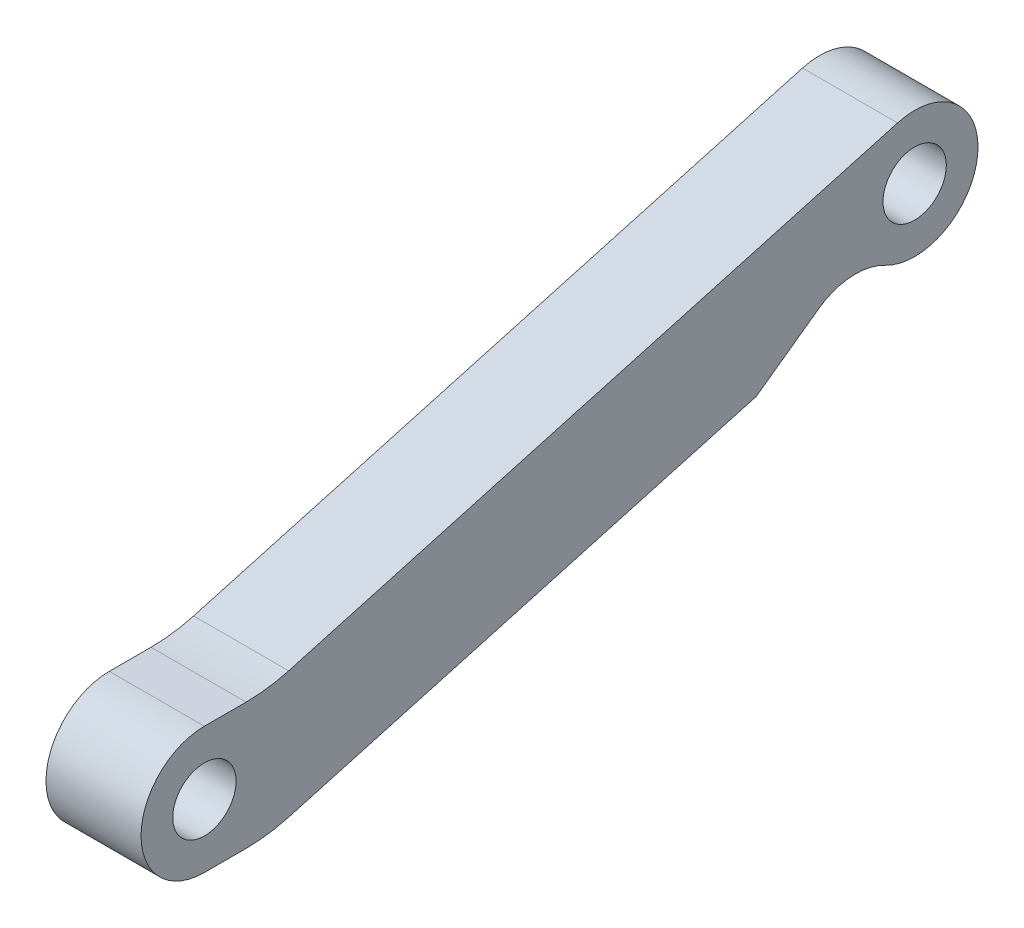
ISO-10303-21;
HEADER;
FILE_DESCRIPTION(('STEP AP214'),'2;1');
FILE_NAME('part.step','',(''),(''),'','','');
FILE_SCHEMA(('AUTOMOTIVE_DESIGN { 1 0 10303 214 1 1 1 1 }'));
ENDSEC;
DATA;
#1=APPLICATION_CONTEXT('core data for automotive mechanical design processes');
#2=APPLICATION_PROTOCOL_DEFINITION('international standard','automotive_design',2000,#1);
#3=PRODUCT_CONTEXT('',#1,'mechanical');
#4=PRODUCT('Part','Part','',(#3));
#5=PRODUCT_RELATED_PRODUCT_CATEGORY('part','',(#4));
#6=PRODUCT_DEFINITION_FORMATION('','',#4);
#7=PRODUCT_DEFINITION_CONTEXT('part definition',#1,'design');
#8=PRODUCT_DEFINITION('design','',#6,#7);
#9=PRODUCT_DEFINITION_SHAPE('','',#8);
#10=(LENGTH_UNIT() NAMED_UNIT(*) SI_UNIT(.MILLI.,.METRE.));
#11=(NAMED_UNIT(*) PLANE_ANGLE_UNIT() SI_UNIT($,.RADIAN.));
#12=(NAMED_UNIT(*) SI_UNIT($,.STERADIAN.) SOLID_ANGLE_UNIT());
#13=UNCERTAINTY_MEASURE_WITH_UNIT(LENGTH_MEASURE(1.E-05),#10,'distance_accuracy_value','');
#14=(GEOMETRIC_REPRESENTATION_CONTEXT(3) GLOBAL_UNCERTAINTY_ASSIGNED_CONTEXT((#13)) GLOBAL_UNIT_ASSIGNED_CONTEXT((#10,
#11,#12)) REPRESENTATION_CONTEXT('',''));
#15=CARTESIAN_POINT('',(0.,0.,0.));
#16=DIRECTION('',(0.,0.,1.));
#17=DIRECTION('',(1.,0.,0.));
#18=AXIS2_PLACEMENT_3D('',#15,#16,#17);
#19=CARTESIAN_POINT('',(-1.5,-1.91202925532679,-63.1081173356861));
#20=DIRECTION('',(1.,0.,0.));
#21=DIRECTION('',(0.,0.,-1.));
#22=AXIS2_PLACEMENT_3D('',#19,#20,#21);
#23=CYLINDRICAL_SURFACE('',#22,2.);
#24=DIRECTION('',(1.,0.,0.));
#25=VECTOR('',#24,1.);
#26=CARTESIAN_POINT('',(-1.5,-0.143514627663402,-64.0421173419712));
#27=LINE('',#26,#25);
#28=CARTESIAN_POINT('',(-1.5,-0.143514627663402,-64.0421173419712));
#29=VERTEX_POINT('',#28);
#30=CARTESIAN_POINT('',(1.5,-0.143514627663402,-64.0421173419712));
#31=VERTEX_POINT('',#30);
#32=EDGE_CURVE('E43',#29,#31,#27,.T.);
#33=ORIENTED_EDGE('',*,*,#32,.T.);
#34=CARTESIAN_POINT('',(1.5,-1.91202925532679,-63.1081173356861));
#35=DIRECTION('',(1.,0.,0.));
#36=DIRECTION('',(0.,0.,-1.));
#37=AXIS2_PLACEMENT_3D('',#34,#35,#36);
#38=CIRCLE('',#37,2.);
#39=CARTESIAN_POINT('',(1.5,-0.285871443395359,-61.9438103440836));
#40=VERTEX_POINT('',#39);
#41=EDGE_CURVE('E120',#31,#40,#38,.T.);
#42=ORIENTED_EDGE('',*,*,#41,.T.);
#43=DIRECTION('',(1.,0.,0.));
#44=VECTOR('',#43,1.);
#45=CARTESIAN_POINT('',(-1.5,-0.285871443395359,-61.9438103440836));
#46=LINE('',#45,#44);
#47=CARTESIAN_POINT('',(-1.5,-0.285871443395359,-61.9438103440836));
#48=VERTEX_POINT('',#47);
#49=EDGE_CURVE('E11',#48,#40,#46,.T.);
#50=ORIENTED_EDGE('',*,*,#49,.F.);
#51=CARTESIAN_POINT('',(-1.5,-1.91202925532679,-63.1081173356861));
#52=DIRECTION('',(1.,0.,0.));
#53=DIRECTION('',(0.,0.,-1.));
#54=AXIS2_PLACEMENT_3D('',#51,#52,#53);
#55=CIRCLE('',#54,2.);
#56=EDGE_CURVE('E56',#29,#48,#55,.T.);
#57=ORIENTED_EDGE('',*,*,#56,.F.);
#58=EDGE_LOOP('',(#33,#42,#50,#57));
#59=FACE_BOUND('',#58,.T.);
#60=ADVANCED_FACE('F39',(#59),#23,.F.);
#61=CARTESIAN_POINT('',(-1.5,-29.5092693167723,-21.1282375735662));
#62=DIRECTION('',(0.,-0.813078905965717,-0.58215349580123));
#63=DIRECTION('',(0.,0.58215349580123,-0.813078905965717));
#64=AXIS2_PLACEMENT_3D('',#61,#62,#63);
#65=PLANE('',#64);
#66=ORIENTED_EDGE('',*,*,#49,.T.);
#67=DIRECTION('',(0.,0.58215349580123,-0.813078905965717));
#68=VECTOR('',#67,1.);
#69=CARTESIAN_POINT('',(1.5,-29.5092693167723,-21.1282375735662));
#70=LINE('',#69,#68);
#71=CARTESIAN_POINT('',(1.5,-1.69471300573291,-59.9761173482563));
#72=VERTEX_POINT('',#71);
#73=EDGE_CURVE('E137',#72,#40,#70,.T.);
#74=ORIENTED_EDGE('',*,*,#73,.F.);
#75=DIRECTION('',(1.,0.,0.));
#76=VECTOR('',#75,1.);
#77=CARTESIAN_POINT('',(-1.5,-1.69471300573291,-59.9761173482563));
#78=LINE('',#77,#76);
#79=CARTESIAN_POINT('',(-1.5,-1.69471300573291,-59.9761173482563));
#80=VERTEX_POINT('',#79);
#81=EDGE_CURVE('E48',#80,#72,#78,.T.);
#82=ORIENTED_EDGE('',*,*,#81,.F.);
#83=DIRECTION('',(0.,0.58215349580123,-0.813078905965717));
#84=VECTOR('',#83,1.);
#85=CARTESIAN_POINT('',(-1.5,-29.5092693167723,-21.1282375735662));
#86=LINE('',#85,#84);
#87=EDGE_CURVE('E124',#80,#48,#86,.T.);
#88=ORIENTED_EDGE('',*,*,#87,.T.);
#89=EDGE_LOOP('',(#66,#74,#82,#88));
#90=FACE_BOUND('',#89,.T.);
#91=ADVANCED_FACE('F232',(#90),#65,.T.);
#92=CARTESIAN_POINT('',(-1.5,-17.108672315639,-4.77751952631985));
#93=DIRECTION('',(0.,-0.96315247012414,-0.268955980215663));
#94=DIRECTION('',(0.,0.268955980215663,-0.96315247012414));
#95=AXIS2_PLACEMENT_3D('',#92,#93,#94);
#96=PLANE('',#95);
#97=ORIENTED_EDGE('',*,*,#81,.T.);
#98=DIRECTION('',(0.,0.268955980215663,-0.96315247012414));
#99=VECTOR('',#98,1.);
#100=CARTESIAN_POINT('',(1.5,-17.108672315639,-4.77751952631985));
#101=LINE('',#100,#99);
#102=CARTESIAN_POINT('',(1.5,-5.8157623506207,-45.2183162655311));
#103=VERTEX_POINT('',#102);
#104=EDGE_CURVE('E161',#103,#72,#101,.T.);
#105=ORIENTED_EDGE('',*,*,#104,.F.);
#106=DIRECTION('',(1.,0.,0.));
#107=VECTOR('',#106,1.);
#108=CARTESIAN_POINT('',(-1.5,-5.8157623506207,-45.2183162655311));
#109=LINE('',#108,#107);
#110=CARTESIAN_POINT('',(-1.5,-5.8157623506207,-45.2183162655311));
#111=VERTEX_POINT('',#110);
#112=EDGE_CURVE('E192',#111,#103,#109,.T.);
#113=ORIENTED_EDGE('',*,*,#112,.F.);
#114=DIRECTION('',(0.,0.268955980215663,-0.96315247012414));
#115=VECTOR('',#114,1.);
#116=CARTESIAN_POINT('',(-1.5,-17.108672315639,-4.77751952631985));
#117=LINE('',#116,#115);
#118=EDGE_CURVE('E188',#111,#80,#117,.T.);
#119=ORIENTED_EDGE('',*,*,#118,.T.);
#120=EDGE_LOOP('',(#97,#105,#113,#119));
#121=FACE_BOUND('',#120,.T.);
#122=ADVANCED_FACE('F230',(#121),#96,.T.);
#123=CARTESIAN_POINT('',(-1.5,-1.00000000000001,-43.8735363644528));
#124=DIRECTION('',(1.,0.,0.));
#125=DIRECTION('',(0.,0.,-1.));
#126=AXIS2_PLACEMENT_3D('',#123,#124,#125);
#127=CYLINDRICAL_SURFACE('',#126,5.);
#128=ORIENTED_EDGE('',*,*,#112,.T.);
#129=CARTESIAN_POINT('',(1.5,-1.00000000000001,-43.8735363644528));
#130=DIRECTION('',(1.,0.,0.));
#131=DIRECTION('',(0.,0.,-1.));
#132=AXIS2_PLACEMENT_3D('',#129,#130,#131);
#133=CIRCLE('',#132,5.);
#134=CARTESIAN_POINT('',(1.5,-6.00000000000001,-43.8735363644528));
#135=VERTEX_POINT('',#134);
#136=EDGE_CURVE('E158',#135,#103,#133,.T.);
#137=ORIENTED_EDGE('',*,*,#136,.F.);
#138=DIRECTION('',(1.,0.,0.));
#139=VECTOR('',#138,1.);
#140=CARTESIAN_POINT('',(-1.5,-6.00000000000001,-43.8735363644528));
#141=LINE('',#140,#139);
#142=CARTESIAN_POINT('',(-1.5,-6.00000000000001,-43.8735363644528));
#143=VERTEX_POINT('',#142);
#144=EDGE_CURVE('E194',#143,#135,#141,.T.);
#145=ORIENTED_EDGE('',*,*,#144,.F.);
#146=CARTESIAN_POINT('',(-1.5,-1.00000000000001,-43.8735363644528));
#147=DIRECTION('',(1.,0.,0.));
#148=DIRECTION('',(0.,0.,-1.));
#149=AXIS2_PLACEMENT_3D('',#146,#147,#148);
#150=CIRCLE('',#149,5.);
#151=EDGE_CURVE('E185',#143,#111,#150,.T.);
#152=ORIENTED_EDGE('',*,*,#151,.T.);
#153=EDGE_LOOP('',(#128,#137,#145,#152));
#154=FACE_BOUND('',#153,.T.);
#155=ADVANCED_FACE('F227',(#154),#127,.T.);
#156=CARTESIAN_POINT('',(-1.5,-6.00000000000004,0.));
#157=DIRECTION('',(0.,-1.,0.));
#158=DIRECTION('',(0.,0.,-1.));
#159=AXIS2_PLACEMENT_3D('',#156,#157,#158);
#160=PLANE('',#159);
#161=ORIENTED_EDGE('',*,*,#144,.T.);
#162=DIRECTION('',(0.,0.,-1.));
#163=VECTOR('',#162,1.);
#164=CARTESIAN_POINT('',(1.5,-6.00000000000004,0.));
#165=LINE('',#164,#163);
#166=CARTESIAN_POINT('',(1.5,-6.00000000000001,-42.5585467859781));
#167=VERTEX_POINT('',#166);
#168=EDGE_CURVE('E155',#167,#135,#165,.T.);
#169=ORIENTED_EDGE('',*,*,#168,.F.);
#170=DIRECTION('',(1.,0.,0.));
#171=VECTOR('',#170,1.);
#172=CARTESIAN_POINT('',(-1.5,-6.00000000000001,-42.5585467859781));
#173=LINE('',#172,#171);
#174=CARTESIAN_POINT('',(-1.5,-6.00000000000001,-42.5585467859781));
#175=VERTEX_POINT('',#174);
#176=EDGE_CURVE('E196',#175,#167,#173,.T.);
#177=ORIENTED_EDGE('',*,*,#176,.F.);
#178=DIRECTION('',(0.,0.,-1.));
#179=VECTOR('',#178,1.);
#180=CARTESIAN_POINT('',(-1.5,-6.00000000000004,0.));
#181=LINE('',#180,#179);
#182=EDGE_CURVE('E182',#175,#143,#181,.T.);
#183=ORIENTED_EDGE('',*,*,#182,.T.);
#184=EDGE_LOOP('',(#161,#169,#177,#183));
#185=FACE_BOUND('',#184,.T.);
#186=ADVANCED_FACE('F223',(#185),#160,.T.);
#187=CARTESIAN_POINT('',(-1.5,-4.00000000000001,-42.5585467859781));
#188=DIRECTION('',(1.,0.,0.));
#189=DIRECTION('',(0.,0.,-1.));
#190=AXIS2_PLACEMENT_3D('',#187,#188,#189);
#191=CYLINDRICAL_SURFACE('',#190,2.);
#192=ORIENTED_EDGE('',*,*,#176,.T.);
#193=CARTESIAN_POINT('',(1.5,-4.00000000000001,-42.5585467859781));
#194=DIRECTION('',(1.,0.,0.));
#195=DIRECTION('',(0.,0.,-1.));
#196=AXIS2_PLACEMENT_3D('',#193,#194,#195);
#197=CIRCLE('',#196,2.);
#198=CARTESIAN_POINT('',(1.5,-2.00000000000001,-42.5585467859781));
#199=VERTEX_POINT('',#198);
#200=EDGE_CURVE('E152',#199,#167,#197,.T.);
#201=ORIENTED_EDGE('',*,*,#200,.F.);
#202=DIRECTION('',(1.,0.,0.));
#203=VECTOR('',#202,1.);
#204=CARTESIAN_POINT('',(-1.5,-2.00000000000001,-42.5585467859781));
#205=LINE('',#204,#203);
#206=CARTESIAN_POINT('',(-1.5,-2.00000000000001,-42.5585467859781));
#207=VERTEX_POINT('',#206);
#208=EDGE_CURVE('E198',#207,#199,#205,.T.);
#209=ORIENTED_EDGE('',*,*,#208,.F.);
#210=CARTESIAN_POINT('',(-1.5,-4.00000000000001,-42.5585467859781));
#211=DIRECTION('',(1.,0.,0.));
#212=DIRECTION('',(0.,0.,-1.));
#213=AXIS2_PLACEMENT_3D('',#210,#211,#212);
#214=CIRCLE('',#213,2.);
#215=EDGE_CURVE('E179',#207,#175,#214,.T.);
#216=ORIENTED_EDGE('',*,*,#215,.T.);
#217=EDGE_LOOP('',(#192,#201,#209,#216));
#218=FACE_BOUND('',#217,.T.);
#219=ADVANCED_FACE('F220',(#218),#191,.T.);
#220=CARTESIAN_POINT('',(-1.5,-2.00000000000001,0.));
#221=DIRECTION('',(0.,-1.,0.));
#222=DIRECTION('',(0.,0.,-1.));
#223=AXIS2_PLACEMENT_3D('',#220,#221,#222);
#224=PLANE('',#223);
#225=ORIENTED_EDGE('',*,*,#208,.T.);
#226=DIRECTION('',(0.,0.,-1.));
#227=VECTOR('',#226,1.);
#228=CARTESIAN_POINT('',(1.5,-2.00000000000001,0.));
#229=LINE('',#228,#227);
#230=CARTESIAN_POINT('',(1.5,-2.00000000000001,-43.8735363644527));
#231=VERTEX_POINT('',#230);
#232=EDGE_CURVE('E149',#199,#231,#229,.T.);
#233=ORIENTED_EDGE('',*,*,#232,.T.);
#234=DIRECTION('',(1.,0.,0.));
#235=VECTOR('',#234,1.);
#236=CARTESIAN_POINT('',(-1.5,-2.00000000000001,-43.8735363644527));
#237=LINE('',#236,#235);
#238=CARTESIAN_POINT('',(-1.5,-2.00000000000001,-43.8735363644527));
#239=VERTEX_POINT('',#238);
#240=EDGE_CURVE('E200',#239,#231,#237,.T.);
#241=ORIENTED_EDGE('',*,*,#240,.F.);
#242=DIRECTION('',(0.,0.,-1.));
#243=VECTOR('',#242,1.);
#244=CARTESIAN_POINT('',(-1.5,-2.00000000000001,0.));
#245=LINE('',#244,#243);
#246=EDGE_CURVE('E177',#207,#239,#245,.T.);
#247=ORIENTED_EDGE('',*,*,#246,.F.);
#248=EDGE_LOOP('',(#225,#233,#241,#247));
#249=FACE_BOUND('',#248,.T.);
#250=ADVANCED_FACE('F215',(#249),#224,.F.);
#251=CARTESIAN_POINT('',(-1.5,2.99999999999999,-43.8735363644527));
#252=DIRECTION('',(1.,0.,0.));
#253=DIRECTION('',(0.,0.,-1.));
#254=AXIS2_PLACEMENT_3D('',#251,#252,#253);
#255=CYLINDRICAL_SURFACE('',#254,5.);
#256=ORIENTED_EDGE('',*,*,#240,.T.);
#257=CARTESIAN_POINT('',(1.5,2.99999999999999,-43.8735363644527));
#258=DIRECTION('',(1.,0.,0.));
#259=DIRECTION('',(0.,0.,-1.));
#260=AXIS2_PLACEMENT_3D('',#257,#258,#259);
#261=CIRCLE('',#260,5.);
#262=CARTESIAN_POINT('',(1.5,-1.8157623506207,-45.2183162655311));
#263=VERTEX_POINT('',#262);
#264=EDGE_CURVE('E146',#231,#263,#261,.T.);
#265=ORIENTED_EDGE('',*,*,#264,.T.);
#266=DIRECTION('',(1.,0.,0.));
#267=VECTOR('',#266,1.);
#268=CARTESIAN_POINT('',(-1.5,-1.8157623506207,-45.2183162655311));
#269=LINE('',#268,#267);
#270=CARTESIAN_POINT('',(-1.5,-1.8157623506207,-45.2183162655311));
#271=VERTEX_POINT('',#270);
#272=EDGE_CURVE('E202',#271,#263,#269,.T.);
#273=ORIENTED_EDGE('',*,*,#272,.F.);
#274=CARTESIAN_POINT('',(-1.5,2.99999999999999,-43.8735363644527));
#275=DIRECTION('',(1.,0.,0.));
#276=DIRECTION('',(0.,0.,-1.));
#277=AXIS2_PLACEMENT_3D('',#274,#275,#276);
#278=CIRCLE('',#277,5.);
#279=EDGE_CURVE('E175',#239,#271,#278,.T.);
#280=ORIENTED_EDGE('',*,*,#279,.F.);
#281=EDGE_LOOP('',(#256,#265,#273,#280));
#282=FACE_BOUND('',#281,.T.);
#283=ADVANCED_FACE('F211',(#282),#255,.F.);
#284=CARTESIAN_POINT('',(-1.5,-13.3980215928141,-3.74133705952235));
#285=DIRECTION('',(0.,-0.96315247012414,-0.268955980215663));
#286=DIRECTION('',(0.,0.268955980215663,-0.96315247012414));
#287=AXIS2_PLACEMENT_3D('',#284,#285,#286);
#288=PLANE('',#287);
#289=ORIENTED_EDGE('',*,*,#272,.T.);
#290=DIRECTION('',(0.,0.268955980215663,-0.96315247012414));
#291=VECTOR('',#290,1.);
#292=CARTESIAN_POINT('',(1.5,-13.3980215928141,-3.74133705952235));
#293=LINE('',#292,#291);
#294=CARTESIAN_POINT('',(1.5,3.55130494024827,-64.438205387825));
#295=VERTEX_POINT('',#294);
#296=EDGE_CURVE('E132',#263,#295,#293,.T.);
#297=ORIENTED_EDGE('',*,*,#296,.T.);
#298=DIRECTION('',(1.,0.,0.));
#299=VECTOR('',#298,1.);
#300=CARTESIAN_POINT('',(-1.5,3.55130494024827,-64.438205387825));
#301=LINE('',#300,#299);
#302=CARTESIAN_POINT('',(-1.5,3.55130494024827,-64.438205387825));
#303=VERTEX_POINT('',#302);
#304=EDGE_CURVE('E123',#303,#295,#301,.T.);
#305=ORIENTED_EDGE('',*,*,#304,.F.);
#306=DIRECTION('',(0.,0.268955980215663,-0.96315247012414));
#307=VECTOR('',#306,1.);
#308=CARTESIAN_POINT('',(-1.5,-13.3980215928141,-3.74133705952235));
#309=LINE('',#308,#307);
#310=EDGE_CURVE('E173',#271,#303,#309,.T.);
#311=ORIENTED_EDGE('',*,*,#310,.F.);
#312=EDGE_LOOP('',(#289,#297,#305,#311));
#313=FACE_BOUND('',#312,.T.);
#314=ADVANCED_FACE('F206',(#313),#288,.F.);
#315=CARTESIAN_POINT('',(-1.5,1.62499999999999,-64.9761173482563));
#316=DIRECTION('',(1.,0.,0.));
#317=DIRECTION('',(0.,0.,-1.));
#318=AXIS2_PLACEMENT_3D('',#315,#316,#317);
#319=CYLINDRICAL_SURFACE('',#318,1.00000000000001);
#320=CARTESIAN_POINT('',(-1.5,1.62499999999999,-64.9761173482563));
#321=DIRECTION('',(1.,0.,0.));
#322=DIRECTION('',(0.,0.,-1.));
#323=AXIS2_PLACEMENT_3D('',#320,#321,#322);
#324=CIRCLE('',#323,1.00000000000001);
#325=CARTESIAN_POINT('',(-1.5,1.62499999999999,-65.9761173482564));
#326=VERTEX_POINT('',#325);
#327=EDGE_CURVE('E167',#326,#326,#324,.T.);
#328=ORIENTED_EDGE('',*,*,#327,.F.);
#329=EDGE_LOOP('',(#328));
#330=FACE_BOUND('',#329,.T.);
#331=CARTESIAN_POINT('',(1.5,1.62499999999999,-64.9761173482563));
#332=DIRECTION('',(1.,0.,0.));
#333=DIRECTION('',(0.,0.,-1.));
#334=AXIS2_PLACEMENT_3D('',#331,#332,#333);
#335=CIRCLE('',#334,1.00000000000001);
#336=CARTESIAN_POINT('',(1.5,1.62499999999999,-65.9761173482564));
#337=VERTEX_POINT('',#336);
#338=EDGE_CURVE('E138',#337,#337,#335,.T.);
#339=ORIENTED_EDGE('',*,*,#338,.T.);
#340=EDGE_LOOP('',(#339));
#341=FACE_BOUND('',#340,.T.);
#342=ADVANCED_FACE('F252',(#330,#341),#319,.F.);
#343=CARTESIAN_POINT('',(-1.5,-4.00000000000001,-42.5585467859781));
#344=DIRECTION('',(1.,0.,0.));
#345=DIRECTION('',(0.,0.,-1.));
#346=AXIS2_PLACEMENT_3D('',#343,#344,#345);
#347=CYLINDRICAL_SURFACE('',#346,1.00000000000001);
#348=CARTESIAN_POINT('',(-1.5,-4.00000000000001,-42.5585467859781));
#349=DIRECTION('',(1.,0.,0.));
#350=DIRECTION('',(0.,0.,-1.));
#351=AXIS2_PLACEMENT_3D('',#348,#349,#350);
#352=CIRCLE('',#351,1.00000000000001);
#353=CARTESIAN_POINT('',(-1.5,-4.00000000000001,-43.5585467859781));
#354=VERTEX_POINT('',#353);
#355=EDGE_CURVE('E164',#354,#354,#352,.T.);
#356=ORIENTED_EDGE('',*,*,#355,.F.);
#357=EDGE_LOOP('',(#356));
#358=FACE_BOUND('',#357,.T.);
#359=CARTESIAN_POINT('',(1.5,-4.00000000000001,-42.5585467859781));
#360=DIRECTION('',(1.,0.,0.));
#361=DIRECTION('',(0.,0.,-1.));
#362=AXIS2_PLACEMENT_3D('',#359,#360,#361);
#363=CIRCLE('',#362,1.00000000000001);
#364=CARTESIAN_POINT('',(1.5,-4.00000000000001,-43.5585467859781));
#365=VERTEX_POINT('',#364);
#366=EDGE_CURVE('E141',#365,#365,#363,.T.);
#367=ORIENTED_EDGE('',*,*,#366,.T.);
#368=EDGE_LOOP('',(#367));
#369=FACE_BOUND('',#368,.T.);
#370=ADVANCED_FACE('F41',(#358,#369),#347,.F.);
#371=CARTESIAN_POINT('',(-1.5,1.62499999999999,-64.9761173482563));
#372=DIRECTION('',(1.,0.,0.));
#373=DIRECTION('',(0.,0.,-1.));
#374=AXIS2_PLACEMENT_3D('',#371,#372,#373);
#375=CYLINDRICAL_SURFACE('',#374,2.);
#376=ORIENTED_EDGE('',*,*,#304,.T.);
#377=CARTESIAN_POINT('',(1.5,1.62499999999999,-64.9761173482563));
#378=DIRECTION('',(1.,0.,0.));
#379=DIRECTION('',(0.,0.,-1.));
#380=AXIS2_PLACEMENT_3D('',#377,#378,#379);
#381=CIRCLE('',#380,2.);
#382=EDGE_CURVE('E126',#31,#295,#381,.T.);
#383=ORIENTED_EDGE('',*,*,#382,.F.);
#384=ORIENTED_EDGE('',*,*,#32,.F.);
#385=CARTESIAN_POINT('',(-1.5,1.62499999999999,-64.9761173482563));
#386=DIRECTION('',(1.,0.,0.));
#387=DIRECTION('',(0.,0.,-1.));
#388=AXIS2_PLACEMENT_3D('',#385,#386,#387);
#389=CIRCLE('',#388,2.);
#390=EDGE_CURVE('E171',#29,#303,#389,.T.);
#391=ORIENTED_EDGE('',*,*,#390,.T.);
#392=EDGE_LOOP('',(#376,#383,#384,#391));
#393=FACE_BOUND('',#392,.T.);
#394=ADVANCED_FACE('F127',(#393),#375,.T.);
#395=CARTESIAN_POINT('',(-1.5,0.,0.));
#396=DIRECTION('',(1.,0.,0.));
#397=DIRECTION('',(0.,0.,-1.));
#398=AXIS2_PLACEMENT_3D('',#395,#396,#397);
#399=PLANE('',#398);
#400=ORIENTED_EDGE('',*,*,#355,.T.);
#401=EDGE_LOOP('',(#400));
#402=FACE_BOUND('',#401,.T.);
#403=ORIENTED_EDGE('',*,*,#327,.T.);
#404=EDGE_LOOP('',(#403));
#405=FACE_BOUND('',#404,.T.);
#406=ORIENTED_EDGE('',*,*,#56,.T.);
#407=ORIENTED_EDGE('',*,*,#87,.F.);
#408=ORIENTED_EDGE('',*,*,#118,.F.);
#409=ORIENTED_EDGE('',*,*,#151,.F.);
#410=ORIENTED_EDGE('',*,*,#182,.F.);
#411=ORIENTED_EDGE('',*,*,#215,.F.);
#412=ORIENTED_EDGE('',*,*,#246,.T.);
#413=ORIENTED_EDGE('',*,*,#279,.T.);
#414=ORIENTED_EDGE('',*,*,#310,.T.);
#415=ORIENTED_EDGE('',*,*,#390,.F.);
#416=EDGE_LOOP('',(#406,#407,#408,#409,#410,#411,#412,#413,#414,#415));
#417=FACE_BOUND('',#416,.T.);
#418=ADVANCED_FACE('F233',(#402,#405,#417),#399,.F.);
#419=CARTESIAN_POINT('',(1.5,0.,0.));
#420=DIRECTION('',(1.,0.,0.));
#421=DIRECTION('',(0.,0.,-1.));
#422=AXIS2_PLACEMENT_3D('',#419,#420,#421);
#423=PLANE('',#422);
#424=ORIENTED_EDGE('',*,*,#366,.F.);
#425=EDGE_LOOP('',(#424));
#426=FACE_BOUND('',#425,.T.);
#427=ORIENTED_EDGE('',*,*,#338,.F.);
#428=EDGE_LOOP('',(#427));
#429=FACE_BOUND('',#428,.T.);
#430=ORIENTED_EDGE('',*,*,#41,.F.);
#431=ORIENTED_EDGE('',*,*,#382,.T.);
#432=ORIENTED_EDGE('',*,*,#296,.F.);
#433=ORIENTED_EDGE('',*,*,#264,.F.);
#434=ORIENTED_EDGE('',*,*,#232,.F.);
#435=ORIENTED_EDGE('',*,*,#200,.T.);
#436=ORIENTED_EDGE('',*,*,#168,.T.);
#437=ORIENTED_EDGE('',*,*,#136,.T.);
#438=ORIENTED_EDGE('',*,*,#104,.T.);
#439=ORIENTED_EDGE('',*,*,#73,.T.);
#440=EDGE_LOOP('',(#430,#431,#432,#433,#434,#435,#436,#437,#438,#439));
#441=FACE_BOUND('',#440,.T.);
#442=ADVANCED_FACE('F135',(#426,#429,#441),#423,.T.);
#443=CLOSED_SHELL('',(#60,#91,#122,#155,#186,#219,#250,#283,#314,#342,#370,#394,#418,#442));
#444=MANIFOLD_SOLID_BREP('B2',#443);
#445=ADVANCED_BREP_SHAPE_REPRESENTATION('',(#18,#444),#14);
#446=SHAPE_DEFINITION_REPRESENTATION(#9,#445);
ENDSEC;
END-ISO-10303-21;
